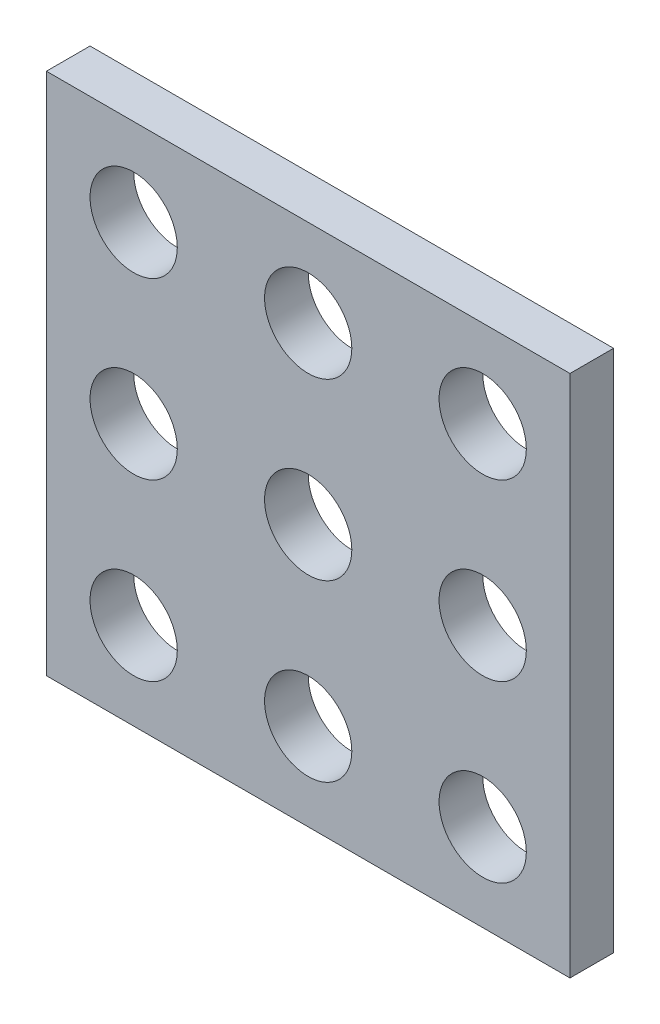
ISO-10303-21;
HEADER;
FILE_DESCRIPTION(('STEP AP214'),'2;1');
FILE_NAME('part.step','',(''),(''),'','','');
FILE_SCHEMA(('AUTOMOTIVE_DESIGN { 1 0 10303 214 1 1 1 1 }'));
ENDSEC;
DATA;
#1=APPLICATION_CONTEXT('core data for automotive mechanical design processes');
#2=APPLICATION_PROTOCOL_DEFINITION('international standard','automotive_design',2000,#1);
#3=PRODUCT_CONTEXT('',#1,'mechanical');
#4=PRODUCT('Part','Part','',(#3));
#5=PRODUCT_RELATED_PRODUCT_CATEGORY('part','',(#4));
#6=PRODUCT_DEFINITION_FORMATION('','',#4);
#7=PRODUCT_DEFINITION_CONTEXT('part definition',#1,'design');
#8=PRODUCT_DEFINITION('design','',#6,#7);
#9=PRODUCT_DEFINITION_SHAPE('','',#8);
#10=(LENGTH_UNIT() NAMED_UNIT(*) SI_UNIT(.MILLI.,.METRE.));
#11=(NAMED_UNIT(*) PLANE_ANGLE_UNIT() SI_UNIT($,.RADIAN.));
#12=(NAMED_UNIT(*) SI_UNIT($,.STERADIAN.) SOLID_ANGLE_UNIT());
#13=UNCERTAINTY_MEASURE_WITH_UNIT(LENGTH_MEASURE(1.E-05),#10,'distance_accuracy_value','');
#14=(GEOMETRIC_REPRESENTATION_CONTEXT(3) GLOBAL_UNCERTAINTY_ASSIGNED_CONTEXT((#13)) GLOBAL_UNIT_ASSIGNED_CONTEXT((#10,
#11,#12)) REPRESENTATION_CONTEXT('',''));
#15=CARTESIAN_POINT('',(0.,0.,0.));
#16=DIRECTION('',(0.,0.,1.));
#17=DIRECTION('',(1.,0.,0.));
#18=AXIS2_PLACEMENT_3D('',#15,#16,#17);
#19=CARTESIAN_POINT('',(50.,50.,5.));
#20=DIRECTION('',(0.,0.,-1.));
#21=DIRECTION('',(-1.,0.,0.));
#22=AXIS2_PLACEMENT_3D('',#19,#20,#21);
#23=CYLINDRICAL_SURFACE('',#22,5.);
#24=CARTESIAN_POINT('',(50.,50.,5.));
#25=DIRECTION('',(0.,0.,1.));
#26=DIRECTION('',(1.,0.,0.));
#27=AXIS2_PLACEMENT_3D('',#24,#25,#26);
#28=CIRCLE('',#27,5.);
#29=CARTESIAN_POINT('',(55.,50.,5.));
#30=VERTEX_POINT('',#29);
#31=EDGE_CURVE('E43',#30,#30,#28,.T.);
#32=ORIENTED_EDGE('',*,*,#31,.T.);
#33=EDGE_LOOP('',(#32));
#34=FACE_BOUND('',#33,.T.);
#35=CARTESIAN_POINT('',(50.,50.,0.));
#36=DIRECTION('',(0.,0.,1.));
#37=DIRECTION('',(1.,0.,0.));
#38=AXIS2_PLACEMENT_3D('',#35,#36,#37);
#39=CIRCLE('',#38,5.);
#40=CARTESIAN_POINT('',(55.,50.,0.));
#41=VERTEX_POINT('',#40);
#42=EDGE_CURVE('E11',#41,#41,#39,.T.);
#43=ORIENTED_EDGE('',*,*,#42,.F.);
#44=EDGE_LOOP('',(#43));
#45=FACE_BOUND('',#44,.T.);
#46=ADVANCED_FACE('F35',(#34,#45),#23,.F.);
#47=CARTESIAN_POINT('',(30.,50.,5.));
#48=DIRECTION('',(0.,0.,-1.));
#49=DIRECTION('',(-1.,0.,0.));
#50=AXIS2_PLACEMENT_3D('',#47,#48,#49);
#51=CYLINDRICAL_SURFACE('',#50,5.);
#52=CARTESIAN_POINT('',(30.,50.,5.));
#53=DIRECTION('',(0.,0.,1.));
#54=DIRECTION('',(1.,0.,0.));
#55=AXIS2_PLACEMENT_3D('',#52,#53,#54);
#56=CIRCLE('',#55,5.);
#57=CARTESIAN_POINT('',(35.,50.,5.));
#58=VERTEX_POINT('',#57);
#59=EDGE_CURVE('E149',#58,#58,#56,.T.);
#60=ORIENTED_EDGE('',*,*,#59,.T.);
#61=EDGE_LOOP('',(#60));
#62=FACE_BOUND('',#61,.T.);
#63=CARTESIAN_POINT('',(30.,50.,0.));
#64=DIRECTION('',(0.,0.,1.));
#65=DIRECTION('',(1.,0.,0.));
#66=AXIS2_PLACEMENT_3D('',#63,#64,#65);
#67=CIRCLE('',#66,5.);
#68=CARTESIAN_POINT('',(35.,50.,0.));
#69=VERTEX_POINT('',#68);
#70=EDGE_CURVE('E152',#69,#69,#67,.T.);
#71=ORIENTED_EDGE('',*,*,#70,.F.);
#72=EDGE_LOOP('',(#71));
#73=FACE_BOUND('',#72,.T.);
#74=ADVANCED_FACE('F206',(#62,#73),#51,.F.);
#75=CARTESIAN_POINT('',(9.99999999999999,50.,5.));
#76=DIRECTION('',(0.,0.,-1.));
#77=DIRECTION('',(-1.,0.,0.));
#78=AXIS2_PLACEMENT_3D('',#75,#76,#77);
#79=CYLINDRICAL_SURFACE('',#78,5.);
#80=CARTESIAN_POINT('',(9.99999999999999,50.,5.));
#81=DIRECTION('',(0.,0.,1.));
#82=DIRECTION('',(1.,0.,0.));
#83=AXIS2_PLACEMENT_3D('',#80,#81,#82);
#84=CIRCLE('',#83,5.);
#85=CARTESIAN_POINT('',(15.,50.,5.));
#86=VERTEX_POINT('',#85);
#87=EDGE_CURVE('E143',#86,#86,#84,.T.);
#88=ORIENTED_EDGE('',*,*,#87,.T.);
#89=EDGE_LOOP('',(#88));
#90=FACE_BOUND('',#89,.T.);
#91=CARTESIAN_POINT('',(9.99999999999999,50.,0.));
#92=DIRECTION('',(0.,0.,1.));
#93=DIRECTION('',(1.,0.,0.));
#94=AXIS2_PLACEMENT_3D('',#91,#92,#93);
#95=CIRCLE('',#94,5.);
#96=CARTESIAN_POINT('',(15.,50.,0.));
#97=VERTEX_POINT('',#96);
#98=EDGE_CURVE('E146',#97,#97,#95,.T.);
#99=ORIENTED_EDGE('',*,*,#98,.F.);
#100=EDGE_LOOP('',(#99));
#101=FACE_BOUND('',#100,.T.);
#102=ADVANCED_FACE('F210',(#90,#101),#79,.F.);
#103=CARTESIAN_POINT('',(50.,30.,5.));
#104=DIRECTION('',(0.,0.,-1.));
#105=DIRECTION('',(-1.,0.,0.));
#106=AXIS2_PLACEMENT_3D('',#103,#104,#105);
#107=CYLINDRICAL_SURFACE('',#106,5.);
#108=CARTESIAN_POINT('',(50.,30.,5.));
#109=DIRECTION('',(0.,0.,1.));
#110=DIRECTION('',(1.,0.,0.));
#111=AXIS2_PLACEMENT_3D('',#108,#109,#110);
#112=CIRCLE('',#111,5.);
#113=CARTESIAN_POINT('',(55.,30.,5.));
#114=VERTEX_POINT('',#113);
#115=EDGE_CURVE('E137',#114,#114,#112,.T.);
#116=ORIENTED_EDGE('',*,*,#115,.T.);
#117=EDGE_LOOP('',(#116));
#118=FACE_BOUND('',#117,.T.);
#119=CARTESIAN_POINT('',(50.,30.,0.));
#120=DIRECTION('',(0.,0.,1.));
#121=DIRECTION('',(1.,0.,0.));
#122=AXIS2_PLACEMENT_3D('',#119,#120,#121);
#123=CIRCLE('',#122,5.);
#124=CARTESIAN_POINT('',(55.,30.,0.));
#125=VERTEX_POINT('',#124);
#126=EDGE_CURVE('E140',#125,#125,#123,.T.);
#127=ORIENTED_EDGE('',*,*,#126,.F.);
#128=EDGE_LOOP('',(#127));
#129=FACE_BOUND('',#128,.T.);
#130=ADVANCED_FACE('F215',(#118,#129),#107,.F.);
#131=CARTESIAN_POINT('',(30.,30.,5.));
#132=DIRECTION('',(0.,0.,-1.));
#133=DIRECTION('',(-1.,0.,0.));
#134=AXIS2_PLACEMENT_3D('',#131,#132,#133);
#135=CYLINDRICAL_SURFACE('',#134,5.);
#136=CARTESIAN_POINT('',(30.,30.,5.));
#137=DIRECTION('',(0.,0.,1.));
#138=DIRECTION('',(1.,0.,0.));
#139=AXIS2_PLACEMENT_3D('',#136,#137,#138);
#140=CIRCLE('',#139,5.);
#141=CARTESIAN_POINT('',(35.,30.,5.));
#142=VERTEX_POINT('',#141);
#143=EDGE_CURVE('E131',#142,#142,#140,.T.);
#144=ORIENTED_EDGE('',*,*,#143,.T.);
#145=EDGE_LOOP('',(#144));
#146=FACE_BOUND('',#145,.T.);
#147=CARTESIAN_POINT('',(30.,30.,0.));
#148=DIRECTION('',(0.,0.,1.));
#149=DIRECTION('',(1.,0.,0.));
#150=AXIS2_PLACEMENT_3D('',#147,#148,#149);
#151=CIRCLE('',#150,5.);
#152=CARTESIAN_POINT('',(35.,30.,0.));
#153=VERTEX_POINT('',#152);
#154=EDGE_CURVE('E134',#153,#153,#151,.T.);
#155=ORIENTED_EDGE('',*,*,#154,.F.);
#156=EDGE_LOOP('',(#155));
#157=FACE_BOUND('',#156,.T.);
#158=ADVANCED_FACE('F222',(#146,#157),#135,.F.);
#159=CARTESIAN_POINT('',(10.,30.,5.));
#160=DIRECTION('',(0.,0.,-1.));
#161=DIRECTION('',(-1.,0.,0.));
#162=AXIS2_PLACEMENT_3D('',#159,#160,#161);
#163=CYLINDRICAL_SURFACE('',#162,5.);
#164=CARTESIAN_POINT('',(10.,30.,5.));
#165=DIRECTION('',(0.,0.,1.));
#166=DIRECTION('',(1.,0.,0.));
#167=AXIS2_PLACEMENT_3D('',#164,#165,#166);
#168=CIRCLE('',#167,5.);
#169=CARTESIAN_POINT('',(15.,30.,5.));
#170=VERTEX_POINT('',#169);
#171=EDGE_CURVE('E125',#170,#170,#168,.T.);
#172=ORIENTED_EDGE('',*,*,#171,.T.);
#173=EDGE_LOOP('',(#172));
#174=FACE_BOUND('',#173,.T.);
#175=CARTESIAN_POINT('',(10.,30.,0.));
#176=DIRECTION('',(0.,0.,1.));
#177=DIRECTION('',(1.,0.,0.));
#178=AXIS2_PLACEMENT_3D('',#175,#176,#177);
#179=CIRCLE('',#178,5.);
#180=CARTESIAN_POINT('',(15.,30.,0.));
#181=VERTEX_POINT('',#180);
#182=EDGE_CURVE('E128',#181,#181,#179,.T.);
#183=ORIENTED_EDGE('',*,*,#182,.F.);
#184=EDGE_LOOP('',(#183));
#185=FACE_BOUND('',#184,.T.);
#186=ADVANCED_FACE('F226',(#174,#185),#163,.F.);
#187=CARTESIAN_POINT('',(50.,10.,5.));
#188=DIRECTION('',(0.,0.,-1.));
#189=DIRECTION('',(-1.,0.,0.));
#190=AXIS2_PLACEMENT_3D('',#187,#188,#189);
#191=CYLINDRICAL_SURFACE('',#190,5.);
#192=CARTESIAN_POINT('',(50.,10.,5.));
#193=DIRECTION('',(0.,0.,1.));
#194=DIRECTION('',(1.,0.,0.));
#195=AXIS2_PLACEMENT_3D('',#192,#193,#194);
#196=CIRCLE('',#195,5.);
#197=CARTESIAN_POINT('',(55.,10.,5.));
#198=VERTEX_POINT('',#197);
#199=EDGE_CURVE('E119',#198,#198,#196,.T.);
#200=ORIENTED_EDGE('',*,*,#199,.T.);
#201=EDGE_LOOP('',(#200));
#202=FACE_BOUND('',#201,.T.);
#203=CARTESIAN_POINT('',(50.,10.,0.));
#204=DIRECTION('',(0.,0.,1.));
#205=DIRECTION('',(1.,0.,0.));
#206=AXIS2_PLACEMENT_3D('',#203,#204,#205);
#207=CIRCLE('',#206,5.);
#208=CARTESIAN_POINT('',(55.,10.,0.));
#209=VERTEX_POINT('',#208);
#210=EDGE_CURVE('E122',#209,#209,#207,.T.);
#211=ORIENTED_EDGE('',*,*,#210,.F.);
#212=EDGE_LOOP('',(#211));
#213=FACE_BOUND('',#212,.T.);
#214=ADVANCED_FACE('F177',(#202,#213),#191,.F.);
#215=CARTESIAN_POINT('',(30.,10.,5.));
#216=DIRECTION('',(0.,0.,-1.));
#217=DIRECTION('',(-1.,0.,0.));
#218=AXIS2_PLACEMENT_3D('',#215,#216,#217);
#219=CYLINDRICAL_SURFACE('',#218,5.);
#220=CARTESIAN_POINT('',(30.,10.,5.));
#221=DIRECTION('',(0.,0.,1.));
#222=DIRECTION('',(1.,0.,0.));
#223=AXIS2_PLACEMENT_3D('',#220,#221,#222);
#224=CIRCLE('',#223,5.);
#225=CARTESIAN_POINT('',(35.,10.,5.));
#226=VERTEX_POINT('',#225);
#227=EDGE_CURVE('E113',#226,#226,#224,.T.);
#228=ORIENTED_EDGE('',*,*,#227,.T.);
#229=EDGE_LOOP('',(#228));
#230=FACE_BOUND('',#229,.T.);
#231=CARTESIAN_POINT('',(30.,10.,0.));
#232=DIRECTION('',(0.,0.,1.));
#233=DIRECTION('',(1.,0.,0.));
#234=AXIS2_PLACEMENT_3D('',#231,#232,#233);
#235=CIRCLE('',#234,5.);
#236=CARTESIAN_POINT('',(35.,10.,0.));
#237=VERTEX_POINT('',#236);
#238=EDGE_CURVE('E116',#237,#237,#235,.T.);
#239=ORIENTED_EDGE('',*,*,#238,.F.);
#240=EDGE_LOOP('',(#239));
#241=FACE_BOUND('',#240,.T.);
#242=ADVANCED_FACE('F162',(#230,#241),#219,.F.);
#243=CARTESIAN_POINT('',(0.,0.,5.));
#244=DIRECTION('',(0.,0.,-1.));
#245=DIRECTION('',(-1.,0.,0.));
#246=AXIS2_PLACEMENT_3D('',#243,#244,#245);
#247=PLANE('',#246);
#248=ORIENTED_EDGE('',*,*,#87,.F.);
#249=EDGE_LOOP('',(#248));
#250=FACE_BOUND('',#249,.T.);
#251=ORIENTED_EDGE('',*,*,#59,.F.);
#252=EDGE_LOOP('',(#251));
#253=FACE_BOUND('',#252,.T.);
#254=ORIENTED_EDGE('',*,*,#31,.F.);
#255=EDGE_LOOP('',(#254));
#256=FACE_BOUND('',#255,.T.);
#257=ORIENTED_EDGE('',*,*,#171,.F.);
#258=EDGE_LOOP('',(#257));
#259=FACE_BOUND('',#258,.T.);
#260=ORIENTED_EDGE('',*,*,#143,.F.);
#261=EDGE_LOOP('',(#260));
#262=FACE_BOUND('',#261,.T.);
#263=ORIENTED_EDGE('',*,*,#115,.F.);
#264=EDGE_LOOP('',(#263));
#265=FACE_BOUND('',#264,.T.);
#266=ORIENTED_EDGE('',*,*,#199,.F.);
#267=EDGE_LOOP('',(#266));
#268=FACE_BOUND('',#267,.T.);
#269=ORIENTED_EDGE('',*,*,#227,.F.);
#270=EDGE_LOOP('',(#269));
#271=FACE_BOUND('',#270,.T.);
#272=DIRECTION('',(0.,-1.,0.));
#273=VECTOR('',#272,1.);
#274=CARTESIAN_POINT('',(0.,0.,5.));
#275=LINE('',#274,#273);
#276=CARTESIAN_POINT('',(0.,60.,5.));
#277=VERTEX_POINT('',#276);
#278=CARTESIAN_POINT('',(0.,0.,5.));
#279=VERTEX_POINT('',#278);
#280=EDGE_CURVE('E88',#277,#279,#275,.T.);
#281=ORIENTED_EDGE('',*,*,#280,.T.);
#282=DIRECTION('',(1.,0.,0.));
#283=VECTOR('',#282,1.);
#284=CARTESIAN_POINT('',(0.,0.,5.));
#285=LINE('',#284,#283);
#286=CARTESIAN_POINT('',(60.,0.,5.));
#287=VERTEX_POINT('',#286);
#288=EDGE_CURVE('E82',#279,#287,#285,.T.);
#289=ORIENTED_EDGE('',*,*,#288,.T.);
#290=DIRECTION('',(0.,1.,0.));
#291=VECTOR('',#290,1.);
#292=CARTESIAN_POINT('',(60.,60.,5.));
#293=LINE('',#292,#291);
#294=CARTESIAN_POINT('',(60.,60.,5.));
#295=VERTEX_POINT('',#294);
#296=EDGE_CURVE('E86',#287,#295,#293,.T.);
#297=ORIENTED_EDGE('',*,*,#296,.T.);
#298=DIRECTION('',(-1.,0.,0.));
#299=VECTOR('',#298,1.);
#300=CARTESIAN_POINT('',(0.,60.,5.));
#301=LINE('',#300,#299);
#302=EDGE_CURVE('E51',#295,#277,#301,.T.);
#303=ORIENTED_EDGE('',*,*,#302,.T.);
#304=EDGE_LOOP('',(#281,#289,#297,#303));
#305=FACE_BOUND('',#304,.T.);
#306=CARTESIAN_POINT('',(10.,10.,5.));
#307=DIRECTION('',(0.,0.,1.));
#308=DIRECTION('',(1.,0.,0.));
#309=AXIS2_PLACEMENT_3D('',#306,#307,#308);
#310=CIRCLE('',#309,5.);
#311=CARTESIAN_POINT('',(15.,10.,5.));
#312=VERTEX_POINT('',#311);
#313=EDGE_CURVE('E106',#312,#312,#310,.T.);
#314=ORIENTED_EDGE('',*,*,#313,.F.);
#315=EDGE_LOOP('',(#314));
#316=FACE_BOUND('',#315,.T.);
#317=ADVANCED_FACE('F83',(#250,#253,#256,#259,#262,#265,#268,#271,#305,#316),#247,.F.);
#318=CARTESIAN_POINT('',(0.,0.,0.));
#319=DIRECTION('',(0.,0.,-1.));
#320=DIRECTION('',(-1.,0.,0.));
#321=AXIS2_PLACEMENT_3D('',#318,#319,#320);
#322=PLANE('',#321);
#323=ORIENTED_EDGE('',*,*,#98,.T.);
#324=EDGE_LOOP('',(#323));
#325=FACE_BOUND('',#324,.T.);
#326=ORIENTED_EDGE('',*,*,#70,.T.);
#327=EDGE_LOOP('',(#326));
#328=FACE_BOUND('',#327,.T.);
#329=ORIENTED_EDGE('',*,*,#42,.T.);
#330=EDGE_LOOP('',(#329));
#331=FACE_BOUND('',#330,.T.);
#332=ORIENTED_EDGE('',*,*,#182,.T.);
#333=EDGE_LOOP('',(#332));
#334=FACE_BOUND('',#333,.T.);
#335=ORIENTED_EDGE('',*,*,#154,.T.);
#336=EDGE_LOOP('',(#335));
#337=FACE_BOUND('',#336,.T.);
#338=ORIENTED_EDGE('',*,*,#126,.T.);
#339=EDGE_LOOP('',(#338));
#340=FACE_BOUND('',#339,.T.);
#341=ORIENTED_EDGE('',*,*,#210,.T.);
#342=EDGE_LOOP('',(#341));
#343=FACE_BOUND('',#342,.T.);
#344=ORIENTED_EDGE('',*,*,#238,.T.);
#345=EDGE_LOOP('',(#344));
#346=FACE_BOUND('',#345,.T.);
#347=DIRECTION('',(0.,-1.,0.));
#348=VECTOR('',#347,1.);
#349=CARTESIAN_POINT('',(0.,0.,0.));
#350=LINE('',#349,#348);
#351=CARTESIAN_POINT('',(0.,60.,0.));
#352=VERTEX_POINT('',#351);
#353=CARTESIAN_POINT('',(0.,0.,0.));
#354=VERTEX_POINT('',#353);
#355=EDGE_CURVE('E103',#352,#354,#350,.T.);
#356=ORIENTED_EDGE('',*,*,#355,.F.);
#357=DIRECTION('',(-1.,0.,0.));
#358=VECTOR('',#357,1.);
#359=CARTESIAN_POINT('',(0.,60.,0.));
#360=LINE('',#359,#358);
#361=CARTESIAN_POINT('',(60.,60.,0.));
#362=VERTEX_POINT('',#361);
#363=EDGE_CURVE('E74',#362,#352,#360,.T.);
#364=ORIENTED_EDGE('',*,*,#363,.F.);
#365=DIRECTION('',(0.,1.,0.));
#366=VECTOR('',#365,1.);
#367=CARTESIAN_POINT('',(60.,60.,0.));
#368=LINE('',#367,#366);
#369=CARTESIAN_POINT('',(60.,0.,0.));
#370=VERTEX_POINT('',#369);
#371=EDGE_CURVE('E68',#370,#362,#368,.T.);
#372=ORIENTED_EDGE('',*,*,#371,.F.);
#373=DIRECTION('',(1.,0.,0.));
#374=VECTOR('',#373,1.);
#375=CARTESIAN_POINT('',(0.,0.,0.));
#376=LINE('',#375,#374);
#377=EDGE_CURVE('E93',#354,#370,#376,.T.);
#378=ORIENTED_EDGE('',*,*,#377,.F.);
#379=EDGE_LOOP('',(#356,#364,#372,#378));
#380=FACE_BOUND('',#379,.T.);
#381=CARTESIAN_POINT('',(10.,10.,0.));
#382=DIRECTION('',(0.,0.,1.));
#383=DIRECTION('',(1.,0.,0.));
#384=AXIS2_PLACEMENT_3D('',#381,#382,#383);
#385=CIRCLE('',#384,5.);
#386=CARTESIAN_POINT('',(15.,10.,0.));
#387=VERTEX_POINT('',#386);
#388=EDGE_CURVE('E190',#387,#387,#385,.T.);
#389=ORIENTED_EDGE('',*,*,#388,.T.);
#390=EDGE_LOOP('',(#389));
#391=FACE_BOUND('',#390,.T.);
#392=ADVANCED_FACE('F161',(#325,#328,#331,#334,#337,#340,#343,#346,#380,#391),#322,.T.);
#393=CARTESIAN_POINT('',(0.,0.,5.));
#394=DIRECTION('',(1.,0.,0.));
#395=DIRECTION('',(0.,0.,-1.));
#396=AXIS2_PLACEMENT_3D('',#393,#394,#395);
#397=PLANE('',#396);
#398=ORIENTED_EDGE('',*,*,#355,.T.);
#399=DIRECTION('',(0.,0.,-1.));
#400=VECTOR('',#399,1.);
#401=CARTESIAN_POINT('',(0.,0.,5.));
#402=LINE('',#401,#400);
#403=EDGE_CURVE('E94',#279,#354,#402,.T.);
#404=ORIENTED_EDGE('',*,*,#403,.F.);
#405=ORIENTED_EDGE('',*,*,#280,.F.);
#406=DIRECTION('',(0.,0.,-1.));
#407=VECTOR('',#406,1.);
#408=CARTESIAN_POINT('',(0.,60.,5.));
#409=LINE('',#408,#407);
#410=EDGE_CURVE('E99',#277,#352,#409,.T.);
#411=ORIENTED_EDGE('',*,*,#410,.T.);
#412=EDGE_LOOP('',(#398,#404,#405,#411));
#413=FACE_BOUND('',#412,.T.);
#414=ADVANCED_FACE('F183',(#413),#397,.F.);
#415=CARTESIAN_POINT('',(0.,0.,5.));
#416=DIRECTION('',(0.,1.,0.));
#417=DIRECTION('',(-1.,0.,0.));
#418=AXIS2_PLACEMENT_3D('',#415,#416,#417);
#419=PLANE('',#418);
#420=ORIENTED_EDGE('',*,*,#377,.T.);
#421=DIRECTION('',(0.,0.,-1.));
#422=VECTOR('',#421,1.);
#423=CARTESIAN_POINT('',(60.,0.,5.));
#424=LINE('',#423,#422);
#425=EDGE_CURVE('E91',#287,#370,#424,.T.);
#426=ORIENTED_EDGE('',*,*,#425,.F.);
#427=ORIENTED_EDGE('',*,*,#288,.F.);
#428=ORIENTED_EDGE('',*,*,#403,.T.);
#429=EDGE_LOOP('',(#420,#426,#427,#428));
#430=FACE_BOUND('',#429,.T.);
#431=ADVANCED_FACE('F92',(#430),#419,.F.);
#432=CARTESIAN_POINT('',(60.,60.,5.));
#433=DIRECTION('',(-1.,0.,0.));
#434=DIRECTION('',(0.,-1.,0.));
#435=AXIS2_PLACEMENT_3D('',#432,#433,#434);
#436=PLANE('',#435);
#437=ORIENTED_EDGE('',*,*,#371,.T.);
#438=DIRECTION('',(0.,0.,-1.));
#439=VECTOR('',#438,1.);
#440=CARTESIAN_POINT('',(60.,60.,5.));
#441=LINE('',#440,#439);
#442=EDGE_CURVE('E95',#295,#362,#441,.T.);
#443=ORIENTED_EDGE('',*,*,#442,.F.);
#444=ORIENTED_EDGE('',*,*,#296,.F.);
#445=ORIENTED_EDGE('',*,*,#425,.T.);
#446=EDGE_LOOP('',(#437,#443,#444,#445));
#447=FACE_BOUND('',#446,.T.);
#448=ADVANCED_FACE('F97',(#447),#436,.F.);
#449=CARTESIAN_POINT('',(0.,60.,5.));
#450=DIRECTION('',(0.,-1.,0.));
#451=DIRECTION('',(1.,0.,0.));
#452=AXIS2_PLACEMENT_3D('',#449,#450,#451);
#453=PLANE('',#452);
#454=ORIENTED_EDGE('',*,*,#363,.T.);
#455=ORIENTED_EDGE('',*,*,#410,.F.);
#456=ORIENTED_EDGE('',*,*,#302,.F.);
#457=ORIENTED_EDGE('',*,*,#442,.T.);
#458=EDGE_LOOP('',(#454,#455,#456,#457));
#459=FACE_BOUND('',#458,.T.);
#460=ADVANCED_FACE('F199',(#459),#453,.F.);
#461=CARTESIAN_POINT('',(10.,10.,5.));
#462=DIRECTION('',(0.,0.,-1.));
#463=DIRECTION('',(-1.,0.,0.));
#464=AXIS2_PLACEMENT_3D('',#461,#462,#463);
#465=CYLINDRICAL_SURFACE('',#464,5.);
#466=ORIENTED_EDGE('',*,*,#313,.T.);
#467=EDGE_LOOP('',(#466));
#468=FACE_BOUND('',#467,.T.);
#469=ORIENTED_EDGE('',*,*,#388,.F.);
#470=EDGE_LOOP('',(#469));
#471=FACE_BOUND('',#470,.T.);
#472=ADVANCED_FACE('F197',(#468,#471),#465,.F.);
#473=CLOSED_SHELL('',(#46,#74,#102,#130,#158,#186,#214,#242,#317,#392,#414,#431,#448,#460,#472));
#474=MANIFOLD_SOLID_BREP('B2',#473);
#475=ADVANCED_BREP_SHAPE_REPRESENTATION('',(#18,#474),#14);
#476=SHAPE_DEFINITION_REPRESENTATION(#9,#475);
ENDSEC;
END-ISO-10303-21;
